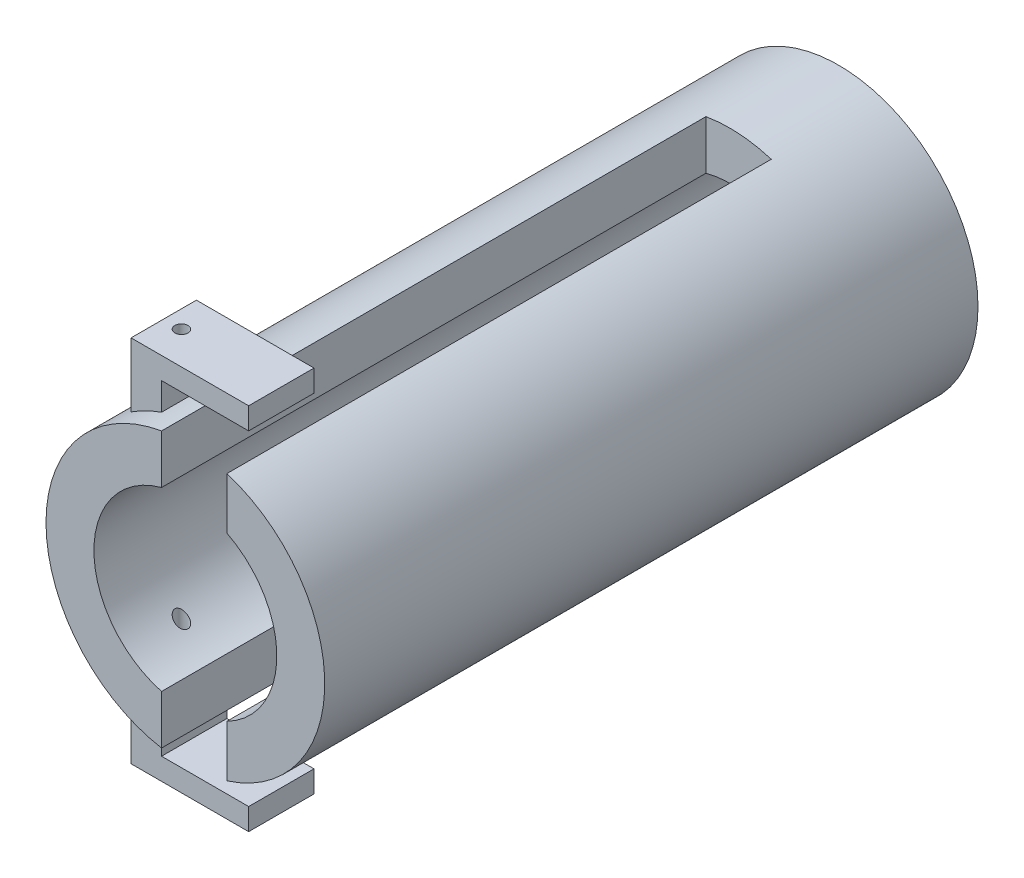
ISO-10303-21;
HEADER;
FILE_DESCRIPTION(('STEP AP214'),'2;1');
FILE_NAME('part.step','',(''),(''),'','','');
FILE_SCHEMA(('AUTOMOTIVE_DESIGN { 1 0 10303 214 1 1 1 1 }'));
ENDSEC;
DATA;
#1=APPLICATION_CONTEXT('core data for automotive mechanical design processes');
#2=APPLICATION_PROTOCOL_DEFINITION('international standard','automotive_design',2000,#1);
#3=PRODUCT_CONTEXT('',#1,'mechanical');
#4=PRODUCT('Part','Part','',(#3));
#5=PRODUCT_RELATED_PRODUCT_CATEGORY('part','',(#4));
#6=PRODUCT_DEFINITION_FORMATION('','',#4);
#7=PRODUCT_DEFINITION_CONTEXT('part definition',#1,'design');
#8=PRODUCT_DEFINITION('design','',#6,#7);
#9=PRODUCT_DEFINITION_SHAPE('','',#8);
#10=(LENGTH_UNIT() NAMED_UNIT(*) SI_UNIT(.MILLI.,.METRE.));
#11=(NAMED_UNIT(*) PLANE_ANGLE_UNIT() SI_UNIT($,.RADIAN.));
#12=(NAMED_UNIT(*) SI_UNIT($,.STERADIAN.) SOLID_ANGLE_UNIT());
#13=UNCERTAINTY_MEASURE_WITH_UNIT(LENGTH_MEASURE(1.E-05),#10,'distance_accuracy_value','');
#14=(GEOMETRIC_REPRESENTATION_CONTEXT(3) GLOBAL_UNCERTAINTY_ASSIGNED_CONTEXT((#13)) GLOBAL_UNIT_ASSIGNED_CONTEXT((#10,
#11,#12)) REPRESENTATION_CONTEXT('',''));
#15=CARTESIAN_POINT('',(0.,0.,0.));
#16=DIRECTION('',(0.,0.,1.));
#17=DIRECTION('',(1.,0.,0.));
#18=AXIS2_PLACEMENT_3D('',#15,#16,#17);
#19=CARTESIAN_POINT('',(-10.4655929490742,-43.1641768158116,130.));
#20=DIRECTION('',(1.,0.,0.));
#21=DIRECTION('',(0.,1.,0.));
#22=AXIS2_PLACEMENT_3D('',#19,#20,#21);
#23=PLANE('',#22);
#24=DIRECTION('',(0.,1.,0.));
#25=VECTOR('',#24,1.);
#26=CARTESIAN_POINT('',(-10.4655929490742,-43.1641768158116,130.));
#27=LINE('',#26,#25);
#28=CARTESIAN_POINT('',(-10.4655929490734,30.2402275822174,130.));
#29=VERTEX_POINT('',#28);
#30=CARTESIAN_POINT('',(-10.4655929490733,36.5327179011301,130.));
#31=VERTEX_POINT('',#30);
#32=EDGE_CURVE('E237',#29,#31,#27,.T.);
#33=ORIENTED_EDGE('',*,*,#32,.T.);
#34=DIRECTION('',(0.,0.,-1.));
#35=VECTOR('',#34,1.);
#36=CARTESIAN_POINT('',(-10.4655929490734,36.5327179011301,145.));
#37=LINE('',#36,#35);
#38=CARTESIAN_POINT('',(-10.4655929490734,36.5327179011301,145.));
#39=VERTEX_POINT('',#38);
#40=EDGE_CURVE('E203',#39,#31,#37,.T.);
#41=ORIENTED_EDGE('',*,*,#40,.F.);
#42=DIRECTION('',(0.,1.,0.));
#43=VECTOR('',#42,1.);
#44=CARTESIAN_POINT('',(-10.4655929490742,-43.1641768158116,145.));
#45=LINE('',#44,#43);
#46=CARTESIAN_POINT('',(-10.4655929490735,30.2402275822174,145.));
#47=VERTEX_POINT('',#46);
#48=EDGE_CURVE('E59',#47,#39,#45,.T.);
#49=ORIENTED_EDGE('',*,*,#48,.F.);
#50=DIRECTION('',(0.,0.,-1.));
#51=VECTOR('',#50,1.);
#52=CARTESIAN_POINT('',(-10.4655929490735,30.2402275822174,150.));
#53=LINE('',#52,#51);
#54=EDGE_CURVE('E225',#47,#29,#53,.T.);
#55=ORIENTED_EDGE('',*,*,#54,.T.);
#56=EDGE_LOOP('',(#33,#41,#49,#55));
#57=FACE_BOUND('',#56,.T.);
#58=ADVANCED_FACE('F43',(#57),#23,.T.);
#59=CARTESIAN_POINT('',(-10.4655929490734,32.002,145.));
#60=DIRECTION('',(1.,0.,0.));
#61=DIRECTION('',(0.,0.,-1.));
#62=AXIS2_PLACEMENT_3D('',#59,#60,#61);
#63=PLANE('',#62);
#64=DIRECTION('',(0.,-1.,0.));
#65=VECTOR('',#64,1.);
#66=CARTESIAN_POINT('',(-10.4655929490734,32.002,145.));
#67=LINE('',#66,#65);
#68=CARTESIAN_POINT('',(-10.4655929490732,-30.2402275822175,145.));
#69=VERTEX_POINT('',#68);
#70=CARTESIAN_POINT('',(-10.4655929490732,-38.1621768158119,145.));
#71=VERTEX_POINT('',#70);
#72=EDGE_CURVE('E292',#69,#71,#67,.T.);
#73=ORIENTED_EDGE('',*,*,#72,.T.);
#74=DIRECTION('',(0.,0.,1.));
#75=VECTOR('',#74,1.);
#76=CARTESIAN_POINT('',(-10.4655929490732,-38.1621768158119,145.));
#77=LINE('',#76,#75);
#78=CARTESIAN_POINT('',(-10.4655929490733,-38.1621768158119,130.));
#79=VERTEX_POINT('',#78);
#80=EDGE_CURVE('E241',#79,#71,#77,.T.);
#81=ORIENTED_EDGE('',*,*,#80,.F.);
#82=DIRECTION('',(0.,-1.,0.));
#83=VECTOR('',#82,1.);
#84=CARTESIAN_POINT('',(-10.4655929490735,32.002,130.));
#85=LINE('',#84,#83);
#86=CARTESIAN_POINT('',(-10.4655929490732,-30.2402275822175,130.));
#87=VERTEX_POINT('',#86);
#88=EDGE_CURVE('E67',#87,#79,#85,.T.);
#89=ORIENTED_EDGE('',*,*,#88,.F.);
#90=DIRECTION('',(0.,0.,-1.));
#91=VECTOR('',#90,1.);
#92=CARTESIAN_POINT('',(-10.4655929490732,-30.2402275822175,150.));
#93=LINE('',#92,#91);
#94=EDGE_CURVE('E288',#87,#69,#93,.F.);
#95=ORIENTED_EDGE('',*,*,#94,.T.);
#96=EDGE_LOOP('',(#73,#81,#89,#95));
#97=FACE_BOUND('',#96,.T.);
#98=ADVANCED_FACE('F445',(#97),#63,.T.);
#99=CARTESIAN_POINT('',(0.,0.,150.));
#100=DIRECTION('',(0.,0.,1.));
#101=DIRECTION('',(1.,0.,0.));
#102=AXIS2_PLACEMENT_3D('',#99,#100,#101);
#103=PLANE('',#102);
#104=DIRECTION('',(0.,-1.,0.));
#105=VECTOR('',#104,1.);
#106=CARTESIAN_POINT('',(9.53440705092656,32.0000000000001,150.));
#107=LINE('',#106,#105);
#108=CARTESIAN_POINT('',(9.53440705092673,-18.7108279396514,150.));
#109=VERTEX_POINT('',#108);
#110=CARTESIAN_POINT('',(9.53440705092677,-30.546605084481,150.));
#111=VERTEX_POINT('',#110);
#112=EDGE_CURVE('E296',#109,#111,#107,.T.);
#113=ORIENTED_EDGE('',*,*,#112,.T.);
#114=CARTESIAN_POINT('',(0.,0.,150.));
#115=DIRECTION('',(0.,0.,1.));
#116=DIRECTION('',(1.,0.,0.));
#117=AXIS2_PLACEMENT_3D('',#114,#115,#116);
#118=CIRCLE('',#117,32.);
#119=CARTESIAN_POINT('',(9.53440705092656,30.546605084481,150.));
#120=VERTEX_POINT('',#119);
#121=EDGE_CURVE('E356',#111,#120,#118,.T.);
#122=ORIENTED_EDGE('',*,*,#121,.T.);
#123=CARTESIAN_POINT('',(9.5344070509266,18.7108279396514,150.));
#124=VERTEX_POINT('',#123);
#125=EDGE_CURVE('E322',#120,#124,#107,.T.);
#126=ORIENTED_EDGE('',*,*,#125,.T.);
#127=CARTESIAN_POINT('',(0.,0.,150.));
#128=DIRECTION('',(0.,0.,1.));
#129=DIRECTION('',(1.,0.,0.));
#130=AXIS2_PLACEMENT_3D('',#127,#128,#129);
#131=CIRCLE('',#130,21.);
#132=EDGE_CURVE('E348',#109,#124,#131,.T.);
#133=ORIENTED_EDGE('',*,*,#132,.F.);
#134=EDGE_LOOP('',(#113,#122,#126,#133));
#135=FACE_BOUND('',#134,.T.);
#136=ADVANCED_FACE('F399',(#135),#103,.T.);
#137=DIRECTION('',(0.,-1.,0.));
#138=VECTOR('',#137,1.);
#139=CARTESIAN_POINT('',(-5.46559294907344,32.0000000000001,150.));
#140=LINE('',#139,#138);
#141=CARTESIAN_POINT('',(-5.46559294907344,31.5297842319772,150.));
#142=VERTEX_POINT('',#141);
#143=CARTESIAN_POINT('',(-5.4655929490734,20.2762741576217,150.));
#144=VERTEX_POINT('',#143);
#145=EDGE_CURVE('E318',#142,#144,#140,.T.);
#146=ORIENTED_EDGE('',*,*,#145,.F.);
#147=CARTESIAN_POINT('',(-5.46559294907323,-31.5297842319772,150.));
#148=VERTEX_POINT('',#147);
#149=EDGE_CURVE('E360',#142,#148,#118,.T.);
#150=ORIENTED_EDGE('',*,*,#149,.T.);
#151=CARTESIAN_POINT('',(-5.46559294907326,-20.2762741576218,150.));
#152=VERTEX_POINT('',#151);
#153=EDGE_CURVE('E319',#152,#148,#140,.T.);
#154=ORIENTED_EDGE('',*,*,#153,.F.);
#155=EDGE_CURVE('E352',#144,#152,#131,.T.);
#156=ORIENTED_EDGE('',*,*,#155,.F.);
#157=EDGE_LOOP('',(#146,#150,#154,#156));
#158=FACE_BOUND('',#157,.T.);
#159=ADVANCED_FACE('F413',(#158),#103,.T.);
#160=CARTESIAN_POINT('',(0.,0.,0.));
#161=DIRECTION('',(0.,0.,1.));
#162=DIRECTION('',(1.,0.,0.));
#163=AXIS2_PLACEMENT_3D('',#160,#161,#162);
#164=PLANE('',#163);
#165=CARTESIAN_POINT('',(0.,0.,0.));
#166=DIRECTION('',(0.,0.,1.));
#167=DIRECTION('',(1.,0.,0.));
#168=AXIS2_PLACEMENT_3D('',#165,#166,#167);
#169=CIRCLE('',#168,32.);
#170=CARTESIAN_POINT('',(32.,0.,0.));
#171=VERTEX_POINT('',#170);
#172=EDGE_CURVE('E361',#171,#171,#169,.T.);
#173=ORIENTED_EDGE('',*,*,#172,.F.);
#174=EDGE_LOOP('',(#173));
#175=FACE_BOUND('',#174,.T.);
#176=CARTESIAN_POINT('',(0.,0.,0.));
#177=DIRECTION('',(0.,0.,1.));
#178=DIRECTION('',(1.,0.,0.));
#179=AXIS2_PLACEMENT_3D('',#176,#177,#178);
#180=CIRCLE('',#179,21.);
#181=CARTESIAN_POINT('',(21.,0.,0.));
#182=VERTEX_POINT('',#181);
#183=EDGE_CURVE('E347',#182,#182,#180,.T.);
#184=ORIENTED_EDGE('',*,*,#183,.T.);
#185=EDGE_LOOP('',(#184));
#186=FACE_BOUND('',#185,.T.);
#187=ADVANCED_FACE('F488',(#175,#186),#164,.F.);
#188=CARTESIAN_POINT('',(0.,0.,150.));
#189=DIRECTION('',(0.,0.,-1.));
#190=DIRECTION('',(-1.,0.,0.));
#191=AXIS2_PLACEMENT_3D('',#188,#189,#190);
#192=CYLINDRICAL_SURFACE('',#191,32.);
#193=CARTESIAN_POINT('',(0.,0.,145.));
#194=DIRECTION('',(0.,0.,1.));
#195=DIRECTION('',(1.,0.,0.));
#196=AXIS2_PLACEMENT_3D('',#193,#194,#195);
#197=CIRCLE('',#196,32.);
#198=CARTESIAN_POINT('',(-17.4655929490735,26.8133001127663,145.));
#199=VERTEX_POINT('',#198);
#200=EDGE_CURVE('E229',#199,#47,#197,.F.);
#201=ORIENTED_EDGE('',*,*,#200,.F.);
#202=DIRECTION('',(0.,0.,-1.));
#203=VECTOR('',#202,1.);
#204=CARTESIAN_POINT('',(-17.4655929490735,26.8133001127663,150.));
#205=LINE('',#204,#203);
#206=CARTESIAN_POINT('',(-17.4655929490734,26.8133001127663,130.));
#207=VERTEX_POINT('',#206);
#208=EDGE_CURVE('E232',#207,#199,#205,.F.);
#209=ORIENTED_EDGE('',*,*,#208,.F.);
#210=CARTESIAN_POINT('',(0.,0.,130.));
#211=DIRECTION('',(0.,0.,-1.));
#212=DIRECTION('',(-1.,0.,0.));
#213=AXIS2_PLACEMENT_3D('',#210,#211,#212);
#214=CIRCLE('',#213,32.);
#215=EDGE_CURVE('E224',#29,#207,#214,.F.);
#216=ORIENTED_EDGE('',*,*,#215,.F.);
#217=ORIENTED_EDGE('',*,*,#54,.F.);
#218=EDGE_LOOP('',(#201,#209,#216,#217));
#219=FACE_BOUND('',#218,.T.);
#220=DIRECTION('',(0.,0.,-1.));
#221=VECTOR('',#220,1.);
#222=CARTESIAN_POINT('',(-17.4655929490732,-26.8133001127665,150.));
#223=LINE('',#222,#221);
#224=CARTESIAN_POINT('',(-17.4655929490732,-26.8133001127665,145.));
#225=VERTEX_POINT('',#224);
#226=CARTESIAN_POINT('',(-17.4655929490733,-26.8133001127664,130.));
#227=VERTEX_POINT('',#226);
#228=EDGE_CURVE('E284',#225,#227,#223,.T.);
#229=ORIENTED_EDGE('',*,*,#228,.F.);
#230=CARTESIAN_POINT('',(0.,0.,145.));
#231=DIRECTION('',(0.,0.,1.));
#232=DIRECTION('',(1.,0.,0.));
#233=AXIS2_PLACEMENT_3D('',#230,#231,#232);
#234=CIRCLE('',#233,32.);
#235=EDGE_CURVE('E283',#69,#225,#234,.F.);
#236=ORIENTED_EDGE('',*,*,#235,.F.);
#237=ORIENTED_EDGE('',*,*,#94,.F.);
#238=CARTESIAN_POINT('',(0.,0.,130.));
#239=DIRECTION('',(0.,0.,-1.));
#240=DIRECTION('',(-1.,0.,0.));
#241=AXIS2_PLACEMENT_3D('',#238,#239,#240);
#242=CIRCLE('',#241,32.);
#243=EDGE_CURVE('E287',#227,#87,#242,.F.);
#244=ORIENTED_EDGE('',*,*,#243,.F.);
#245=EDGE_LOOP('',(#229,#236,#237,#244));
#246=FACE_BOUND('',#245,.T.);
#247=DIRECTION('',(0.,0.,-1.));
#248=VECTOR('',#247,1.);
#249=CARTESIAN_POINT('',(-5.46559294907344,31.5297842319772,150.));
#250=LINE('',#249,#248);
#251=CARTESIAN_POINT('',(-5.46559294907386,31.5297842319772,24.9999999999999));
#252=VERTEX_POINT('',#251);
#253=EDGE_CURVE('E330',#142,#252,#250,.T.);
#254=ORIENTED_EDGE('',*,*,#253,.T.);
#255=CARTESIAN_POINT('',(0.,0.,24.9999999999999));
#256=DIRECTION('',(0.,0.,-1.));
#257=DIRECTION('',(-1.,0.,0.));
#258=AXIS2_PLACEMENT_3D('',#255,#256,#257);
#259=CIRCLE('',#258,32.);
#260=CARTESIAN_POINT('',(9.53440705092612,30.5466050844812,24.9999999999998));
#261=VERTEX_POINT('',#260);
#262=EDGE_CURVE('E338',#252,#261,#259,.T.);
#263=ORIENTED_EDGE('',*,*,#262,.T.);
#264=DIRECTION('',(0.,0.,-1.));
#265=VECTOR('',#264,1.);
#266=CARTESIAN_POINT('',(9.53440705092656,30.546605084481,150.));
#267=LINE('',#266,#265);
#268=EDGE_CURVE('E339',#261,#120,#267,.F.);
#269=ORIENTED_EDGE('',*,*,#268,.T.);
#270=ORIENTED_EDGE('',*,*,#121,.F.);
#271=DIRECTION('',(0.,0.,-1.));
#272=VECTOR('',#271,1.);
#273=CARTESIAN_POINT('',(9.53440705092677,-30.546605084481,150.));
#274=LINE('',#273,#272);
#275=CARTESIAN_POINT('',(9.53440705092633,-30.5466050844811,24.9999999999998));
#276=VERTEX_POINT('',#275);
#277=EDGE_CURVE('E343',#111,#276,#274,.T.);
#278=ORIENTED_EDGE('',*,*,#277,.T.);
#279=CARTESIAN_POINT('',(-5.46559294907365,-31.5297842319772,24.9999999999999));
#280=VERTEX_POINT('',#279);
#281=EDGE_CURVE('E334',#276,#280,#259,.T.);
#282=ORIENTED_EDGE('',*,*,#281,.T.);
#283=DIRECTION('',(0.,0.,-1.));
#284=VECTOR('',#283,1.);
#285=CARTESIAN_POINT('',(-5.46559294907323,-31.5297842319772,150.));
#286=LINE('',#285,#284);
#287=EDGE_CURVE('E326',#280,#148,#286,.F.);
#288=ORIENTED_EDGE('',*,*,#287,.T.);
#289=ORIENTED_EDGE('',*,*,#149,.F.);
#290=EDGE_LOOP('',(#254,#263,#269,#270,#278,#282,#288,#289));
#291=FACE_BOUND('',#290,.T.);
#292=ORIENTED_EDGE('',*,*,#172,.T.);
#293=EDGE_LOOP('',(#292));
#294=FACE_BOUND('',#293,.T.);
#295=ADVANCED_FACE('F45',(#219,#246,#291,#294),#192,.T.);
#296=CARTESIAN_POINT('',(0.,0.,150.));
#297=DIRECTION('',(0.,0.,-1.));
#298=DIRECTION('',(-1.,0.,0.));
#299=AXIS2_PLACEMENT_3D('',#296,#297,#298);
#300=CYLINDRICAL_SURFACE('',#299,21.);
#301=CARTESIAN_POINT('',(-11.9052452002642,17.2992813932136,137.5));
#302=CARTESIAN_POINT('',(-11.9052548265942,17.2992755508608,137.573044116723));
#303=CARTESIAN_POINT('',(-11.9106205752926,17.295585983972,137.646197513668));
#304=CARTESIAN_POINT('',(-11.9318019819764,17.2809795849291,137.790349620127));
#305=CARTESIAN_POINT('',(-11.9476443826521,17.2700442571132,137.861342327892));
#306=CARTESIAN_POINT('',(-11.9887861127634,17.241508811331,137.99876218566));
#307=CARTESIAN_POINT('',(-12.014045424554,17.2239368918283,138.065207266594));
#308=CARTESIAN_POINT('',(-12.07273230127,17.1828522462299,138.192325739823));
#309=CARTESIAN_POINT('',(-12.1061573190968,17.1593413725725,138.253000923718));
#310=CARTESIAN_POINT('',(-12.1818833095306,17.1056712265187,138.370964200516));
#311=CARTESIAN_POINT('',(-12.2245860160203,17.0752059315197,138.427853042159));
#312=CARTESIAN_POINT('',(-12.3158826277543,17.0094738931302,138.533524338874));
#313=CARTESIAN_POINT('',(-12.3644794002015,16.9742048118754,138.582302821039));
#314=CARTESIAN_POINT('',(-12.4744038412467,16.8936262634548,138.678866728555));
#315=CARTESIAN_POINT('',(-12.5365123417045,16.8476187589333,138.725177471959));
#316=CARTESIAN_POINT('',(-12.6646903137788,16.7514792161448,138.8066584163));
#317=CARTESIAN_POINT('',(-12.7307623534542,16.7013444957649,138.841821299537));
#318=CARTESIAN_POINT('',(-12.8786505324283,16.587666416646,138.907292403603));
#319=CARTESIAN_POINT('',(-12.9609842642626,16.5234394817461,138.935243911826));
#320=CARTESIAN_POINT('',(-13.1268694347995,16.391965565268,138.976421626484));
#321=CARTESIAN_POINT('',(-13.2104214627617,16.3247170871463,138.989640450419));
#322=CARTESIAN_POINT('',(-13.3931402778305,16.1752970561648,139.003257623873));
#323=CARTESIAN_POINT('',(-13.492219901029,16.0927427211358,139.000701570316));
#324=CARTESIAN_POINT('',(-13.6875943737514,15.9269027502493,138.97647828892));
#325=CARTESIAN_POINT('',(-13.7838845842737,15.8436161662836,138.954780922891));
#326=CARTESIAN_POINT('',(-13.9821053811629,15.669079613006,138.889010290197));
#327=CARTESIAN_POINT('',(-14.0834440613879,15.5779930916758,138.842685883429));
#328=CARTESIAN_POINT('',(-14.2766026823651,15.4011571407549,138.726141715687));
#329=CARTESIAN_POINT('',(-14.368442309674,15.3153968264529,138.655972721103));
#330=CARTESIAN_POINT('',(-14.5054296733106,15.1854461811735,138.522217981724));
#331=CARTESIAN_POINT('',(-14.5549996155984,15.1379033470334,138.466381766895));
#332=CARTESIAN_POINT('',(-14.6470179251289,15.0488846844269,138.344860345745));
#333=CARTESIAN_POINT('',(-14.6894785218866,15.0073984534578,138.279192428451));
#334=CARTESIAN_POINT('',(-14.7572487648846,14.9407294148004,138.152773966086));
#335=CARTESIAN_POINT('',(-14.7842895484931,14.9139488384994,138.093803404615));
#336=CARTESIAN_POINT('',(-14.8311000527988,14.8673993304998,137.970405449812));
#337=CARTESIAN_POINT('',(-14.8508741971697,14.8476261332181,137.905981405858));
#338=CARTESIAN_POINT('',(-14.8818945608282,14.8165351093517,137.772464925328));
#339=CARTESIAN_POINT('',(-14.893065311665,14.8052921217324,137.703336838484));
#340=CARTESIAN_POINT('',(-14.9055508564446,14.7927225828124,137.563317276506));
#341=CARTESIAN_POINT('',(-14.9068736953809,14.7913879371539,137.492427288228));
#342=CARTESIAN_POINT('',(-14.9000709408295,14.7982395648824,137.361449128951));
#343=CARTESIAN_POINT('',(-14.8932215895962,14.8051398363758,137.30121797823));
#344=CARTESIAN_POINT('',(-14.8726295320708,14.8258255041481,137.183182362743));
#345=CARTESIAN_POINT('',(-14.8588854849967,14.8396122396061,137.125378372348));
#346=CARTESIAN_POINT('',(-14.8249050977801,14.8735595306512,137.011981202268));
#347=CARTESIAN_POINT('',(-14.8045117826467,14.8938740049396,136.95648230499));
#348=CARTESIAN_POINT('',(-14.7583605076822,14.9396068839805,136.850037934527));
#349=CARTESIAN_POINT('',(-14.732599797427,14.9650279052497,136.799094815072));
#350=CARTESIAN_POINT('',(-14.6612361215834,15.0350196334455,136.675364553637));
#351=CARTESIAN_POINT('',(-14.6125127689926,15.082432561015,136.605974453225));
#352=CARTESIAN_POINT('',(-14.5071609770133,15.1837961619827,136.478908732529));
#353=CARTESIAN_POINT('',(-14.4505122623975,15.2377635552457,136.421264120046));
#354=CARTESIAN_POINT('',(-14.3114302866695,15.3686308028926,136.300023909923));
#355=CARTESIAN_POINT('',(-14.2266958554917,15.4471791121736,136.240847918807));
#356=CARTESIAN_POINT('',(-14.0500060121881,15.608064109138,136.14185883437));
#357=CARTESIAN_POINT('',(-13.9580474467042,15.6904024446137,136.102054251891));
#358=CARTESIAN_POINT('',(-13.7676786363668,15.8577213794313,136.040963787914));
#359=CARTESIAN_POINT('',(-13.6691885264799,15.9427231765462,136.019985409855));
#360=CARTESIAN_POINT('',(-13.4692629747421,16.111987087823,135.99799488572));
#361=CARTESIAN_POINT('',(-13.3678256238155,16.196248674328,135.996995983735));
#362=CARTESIAN_POINT('',(-13.15521795371,16.3695047565603,136.016792053278));
#363=CARTESIAN_POINT('',(-13.0440021414693,16.4582319286303,136.039579053535));
#364=CARTESIAN_POINT('',(-12.8253138727645,16.6292051039563,136.11187904325));
#365=CARTESIAN_POINT('',(-12.7178343204254,16.7114638150159,136.161338050089));
#366=CARTESIAN_POINT('',(-12.5470098163756,16.8398313462938,136.267164081613));
#367=CARTESIAN_POINT('',(-12.4809333364183,16.8888245617175,136.315678358624));
#368=CARTESIAN_POINT('',(-12.3554618318187,16.9808296313963,136.425351061054));
#369=CARTESIAN_POINT('',(-12.2960565481847,17.0238506943972,136.486489650007));
#370=CARTESIAN_POINT('',(-12.1952088764273,17.0962023306363,136.610519397818));
#371=CARTESIAN_POINT('',(-12.1524094814051,17.1266213717917,136.671668694717));
#372=CARTESIAN_POINT('',(-12.0754433857335,17.1809746596213,136.801903002128));
#373=CARTESIAN_POINT('',(-12.0412795545109,17.204906751001,136.870990639331));
#374=CARTESIAN_POINT('',(-11.9832989817467,17.2453418165766,137.016042415099));
#375=CARTESIAN_POINT('',(-11.9595562340493,17.2617916930384,137.092051243928));
#376=CARTESIAN_POINT('',(-11.9244129333531,17.2860883676311,137.248044440917));
#377=CARTESIAN_POINT('',(-11.9129729434584,17.2939626561281,137.328015241286));
#378=CARTESIAN_POINT('',(-11.9061745459405,17.298641575654,137.438903471857));
#379=CARTESIAN_POINT('',(-11.9052411731127,17.2992838373476,137.469442173108));
#380=CARTESIAN_POINT('',(-11.9052452002642,17.2992813932136,137.5));
#381=B_SPLINE_CURVE_WITH_KNOTS('',3,(#301,#302,#303,#304,#305,#306,#307,#308,#309,#310,#311,
#312,#313,#314,#315,#316,#317,#318,#319,#320,#321,#322,#323,#324,#325,#326,#327,#328,#329,#330,
#331,#332,#333,#334,#335,#336,#337,#338,#339,#340,#341,#342,#343,#344,#345,#346,#347,#348,#349,
#350,#351,#352,#353,#354,#355,#356,#357,#358,#359,#360,#361,#362,#363,#364,#365,#366,#367,#368,
#369,#370,#371,#372,#373,#374,#375,#376,#377,#378,#379,#380),.UNSPECIFIED.,.T.,.F.,(4,2,2,2,2,2,
2,2,2,2,2,2,2,2,2,2,2,2,2,2,2,2,2,2,2,2,2,2,2,2,2,2,2,2,2,2,2,2,2,4),(0.,0.21903959242567,
0.438640474464683,0.657318595790343,0.875928592557461,1.10719045162189,1.33856526401803,
1.6078838377831,1.87737883387967,2.20047687162462,2.5237367400696,2.90916314853013,
3.29519750006137,3.72484748081865,4.15358838633279,4.41832259995696,4.68259663120421,
4.89235532376933,5.10198611026862,5.31343545766322,5.52471204808042,5.70688943648973,
5.88910226590239,6.07597280624511,6.26293934155278,6.55274272200877,6.84330153699267,
7.23069818161217,7.61826487587563,8.01205249573606,8.40610114276814,8.83601743925096,
9.26506685757901,9.5505130724608,9.83551413561295,10.0763213313497,10.3172084376761,
10.5597793101415,10.80157027446,10.8932049501633),.UNSPECIFIED.);
#382=CARTESIAN_POINT('',(-11.9052452002642,17.2992813932136,137.5));
#383=VERTEX_POINT('',#382);
#384=EDGE_CURVE('E514',#383,#383,#381,.T.);
#385=ORIENTED_EDGE('',*,*,#384,.F.);
#386=EDGE_LOOP('',(#385));
#387=FACE_BOUND('',#386,.T.);
#388=CARTESIAN_POINT('',(-11.9052452002641,-17.2992813932137,137.5));
#389=CARTESIAN_POINT('',(-11.9052548265941,-17.2992755508609,137.426955883277));
#390=CARTESIAN_POINT('',(-11.9106205752924,-17.2955859839721,137.353802486332));
#391=CARTESIAN_POINT('',(-11.9318019819763,-17.2809795849292,137.209650379873));
#392=CARTESIAN_POINT('',(-11.9476443826519,-17.2700442571133,137.138657672108));
#393=CARTESIAN_POINT('',(-11.9887861127633,-17.2415088113311,137.00123781434));
#394=CARTESIAN_POINT('',(-12.0140454245539,-17.2239368918284,136.934792733407));
#395=CARTESIAN_POINT('',(-12.0727323012699,-17.18285224623,136.807674260178));
#396=CARTESIAN_POINT('',(-12.1061573190967,-17.1593413725726,136.746999076282));
#397=CARTESIAN_POINT('',(-12.1818833095305,-17.1056712265188,136.629035799484));
#398=CARTESIAN_POINT('',(-12.2245860160201,-17.0752059315198,136.572146957841));
#399=CARTESIAN_POINT('',(-12.3158826277542,-17.0094738931303,136.466475661126));
#400=CARTESIAN_POINT('',(-12.3644794002014,-16.9742048118755,136.417697178962));
#401=CARTESIAN_POINT('',(-12.4744038412465,-16.8936262634549,136.321133271445));
#402=CARTESIAN_POINT('',(-12.5365123417044,-16.8476187589333,136.274822528042));
#403=CARTESIAN_POINT('',(-12.6646903137787,-16.7514792161449,136.193341583701));
#404=CARTESIAN_POINT('',(-12.7307623534541,-16.701344495765,136.158178700463));
#405=CARTESIAN_POINT('',(-12.8786505324282,-16.5876664166461,136.092707596397));
#406=CARTESIAN_POINT('',(-12.9609842642625,-16.5234394817462,136.064756088174));
#407=CARTESIAN_POINT('',(-13.1268694347993,-16.3919655652681,136.023578373516));
#408=CARTESIAN_POINT('',(-13.2104214627616,-16.3247170871464,136.010359549582));
#409=CARTESIAN_POINT('',(-13.3931402778303,-16.1752970561649,135.996742376127));
#410=CARTESIAN_POINT('',(-13.4922199010289,-16.0927427211359,135.999298429684));
#411=CARTESIAN_POINT('',(-13.6875943737513,-15.9269027502494,136.02352171108));
#412=CARTESIAN_POINT('',(-13.7838845842736,-15.8436161662838,136.04521907711));
#413=CARTESIAN_POINT('',(-13.9821053811628,-15.6690796130061,136.110989709803));
#414=CARTESIAN_POINT('',(-14.0834440613878,-15.5779930916759,136.157314116571));
#415=CARTESIAN_POINT('',(-14.2766026823649,-15.401157140755,136.273858284313));
#416=CARTESIAN_POINT('',(-14.3684423096739,-15.315396826453,136.344027278897));
#417=CARTESIAN_POINT('',(-14.5054296733105,-15.1854461811736,136.477782018276));
#418=CARTESIAN_POINT('',(-14.5549996155983,-15.1379033470335,136.533618233105));
#419=CARTESIAN_POINT('',(-14.6470179251288,-15.048884684427,136.655139654255));
#420=CARTESIAN_POINT('',(-14.6894785218864,-15.007398453458,136.720807571549));
#421=CARTESIAN_POINT('',(-14.7572487648845,-14.9407294148006,136.847226033914));
#422=CARTESIAN_POINT('',(-14.784289548493,-14.9139488384995,136.906196595385));
#423=CARTESIAN_POINT('',(-14.8311000527987,-14.8673993304999,137.029594550188));
#424=CARTESIAN_POINT('',(-14.8508741971696,-14.8476261332182,137.094018594142));
#425=CARTESIAN_POINT('',(-14.8818945608281,-14.8165351093519,137.227535074672));
#426=CARTESIAN_POINT('',(-14.8930653116649,-14.8052921217325,137.296663161516));
#427=CARTESIAN_POINT('',(-14.9055508564445,-14.7927225828125,137.436682723494));
#428=CARTESIAN_POINT('',(-14.9068736953808,-14.791387937154,137.507572711772));
#429=CARTESIAN_POINT('',(-14.9000709408294,-14.7982395648825,137.638550871049));
#430=CARTESIAN_POINT('',(-14.893221589596,-14.8051398363759,137.69878202177));
#431=CARTESIAN_POINT('',(-14.8726295320707,-14.8258255041482,137.816817637257));
#432=CARTESIAN_POINT('',(-14.8588854849966,-14.8396122396063,137.874621627653));
#433=CARTESIAN_POINT('',(-14.82490509778,-14.8735595306513,137.988018797732));
#434=CARTESIAN_POINT('',(-14.8045117826466,-14.8938740049397,138.04351769501));
#435=CARTESIAN_POINT('',(-14.7583605076821,-14.9396068839806,138.149962065473));
#436=CARTESIAN_POINT('',(-14.7325997974269,-14.9650279052498,138.200905184928));
#437=CARTESIAN_POINT('',(-14.6612361215833,-15.0350196334456,138.324635446363));
#438=CARTESIAN_POINT('',(-14.6125127689925,-15.0824325610151,138.394025546775));
#439=CARTESIAN_POINT('',(-14.5071609770132,-15.1837961619828,138.521091267472));
#440=CARTESIAN_POINT('',(-14.4505122623974,-15.2377635552458,138.578735879954));
#441=CARTESIAN_POINT('',(-14.3114302866693,-15.3686308028927,138.699976090077));
#442=CARTESIAN_POINT('',(-14.2266958554915,-15.4471791121737,138.759152081193));
#443=CARTESIAN_POINT('',(-14.0500060121879,-15.6080641091381,138.85814116563));
#444=CARTESIAN_POINT('',(-13.958047446704,-15.6904024446138,138.897945748109));
#445=CARTESIAN_POINT('',(-13.7676786363666,-15.8577213794315,138.959036212086));
#446=CARTESIAN_POINT('',(-13.6691885264797,-15.9427231765463,138.980014590146));
#447=CARTESIAN_POINT('',(-13.469262974742,-16.1119870878232,139.00200511428));
#448=CARTESIAN_POINT('',(-13.3678256238153,-16.1962486743282,139.003004016265));
#449=CARTESIAN_POINT('',(-13.1552179537098,-16.3695047565604,138.983207946722));
#450=CARTESIAN_POINT('',(-13.0440021414692,-16.4582319286304,138.960420946465));
#451=CARTESIAN_POINT('',(-12.8253138727643,-16.6292051039564,138.88812095675));
#452=CARTESIAN_POINT('',(-12.7178343204252,-16.711463815016,138.838661949911));
#453=CARTESIAN_POINT('',(-12.5470098163755,-16.8398313462939,138.732835918387));
#454=CARTESIAN_POINT('',(-12.4809333364181,-16.8888245617176,138.684321641376));
#455=CARTESIAN_POINT('',(-12.3554618318185,-16.9808296313964,138.574648938947));
#456=CARTESIAN_POINT('',(-12.2960565481846,-17.0238506943973,138.513510349993));
#457=CARTESIAN_POINT('',(-12.1952088764271,-17.0962023306364,138.389480602182));
#458=CARTESIAN_POINT('',(-12.1524094814049,-17.1266213717918,138.328331305283));
#459=CARTESIAN_POINT('',(-12.0754433857333,-17.1809746596214,138.198096997872));
#460=CARTESIAN_POINT('',(-12.0412795545107,-17.2049067510011,138.129009360669));
#461=CARTESIAN_POINT('',(-11.9832989817465,-17.2453418165767,137.983957584901));
#462=CARTESIAN_POINT('',(-11.9595562340491,-17.2617916930385,137.907948756072));
#463=CARTESIAN_POINT('',(-11.9244129333529,-17.2860883676312,137.751955559083));
#464=CARTESIAN_POINT('',(-11.9129729434582,-17.2939626561282,137.671984758714));
#465=CARTESIAN_POINT('',(-11.9061745459403,-17.2986415756541,137.561096528143));
#466=CARTESIAN_POINT('',(-11.9052411731125,-17.2992838373477,137.530557826892));
#467=CARTESIAN_POINT('',(-11.9052452002641,-17.2992813932137,137.5));
#468=B_SPLINE_CURVE_WITH_KNOTS('',3,(#388,#389,#390,#391,#392,#393,#394,#395,#396,#397,#398,
#399,#400,#401,#402,#403,#404,#405,#406,#407,#408,#409,#410,#411,#412,#413,#414,#415,#416,#417,
#418,#419,#420,#421,#422,#423,#424,#425,#426,#427,#428,#429,#430,#431,#432,#433,#434,#435,#436,
#437,#438,#439,#440,#441,#442,#443,#444,#445,#446,#447,#448,#449,#450,#451,#452,#453,#454,#455,
#456,#457,#458,#459,#460,#461,#462,#463,#464,#465,#466,#467),.UNSPECIFIED.,.T.,.F.,(4,2,2,2,2,2,
2,2,2,2,2,2,2,2,2,2,2,2,2,2,2,2,2,2,2,2,2,2,2,2,2,2,2,2,2,2,2,2,2,4),(0.,0.219039592425671,
0.438640474464684,0.657318595790343,0.875928592557437,1.10719045162188,1.33856526401803,
1.6078838377831,1.87737883387967,2.20047687162461,2.52373674006958,2.90916314853012,
3.29519750006136,3.72484748081865,4.15358838633278,4.41832259995695,4.68259663120422,
4.89235532376938,5.10198611026861,5.31343545766327,5.52471204808041,5.70688943648969,
5.88910226590235,6.0759728062451,6.26293934155277,6.55274272200878,6.84330153699269,
7.23069818161219,7.61826487587566,8.01205249573608,8.40610114276816,8.83601743925097,
9.26506685757902,9.55051307246081,9.83551413561297,10.0763213313498,10.3172084376761,
10.5597793101415,10.8015702744599,10.8932049501633),.UNSPECIFIED.);
#469=CARTESIAN_POINT('',(-11.9052452002641,-17.2992813932137,137.5));
#470=VERTEX_POINT('',#469);
#471=EDGE_CURVE('E517',#470,#470,#468,.T.);
#472=ORIENTED_EDGE('',*,*,#471,.F.);
#473=EDGE_LOOP('',(#472));
#474=FACE_BOUND('',#473,.T.);
#475=DIRECTION('',(0.,0.,-1.));
#476=VECTOR('',#475,1.);
#477=CARTESIAN_POINT('',(9.5344070509266,18.7108279396514,150.));
#478=LINE('',#477,#476);
#479=CARTESIAN_POINT('',(9.53440705092616,18.7108279396517,24.9999999999998));
#480=VERTEX_POINT('',#479);
#481=EDGE_CURVE('E11',#480,#124,#478,.F.);
#482=ORIENTED_EDGE('',*,*,#481,.F.);
#483=CARTESIAN_POINT('',(0.,0.,24.9999999999999));
#484=DIRECTION('',(0.,0.,-1.));
#485=DIRECTION('',(-1.,0.,0.));
#486=AXIS2_PLACEMENT_3D('',#483,#484,#485);
#487=CIRCLE('',#486,21.);
#488=CARTESIAN_POINT('',(-5.46559294907382,20.2762741576217,24.9999999999999));
#489=VERTEX_POINT('',#488);
#490=EDGE_CURVE('E52',#489,#480,#487,.T.);
#491=ORIENTED_EDGE('',*,*,#490,.F.);
#492=DIRECTION('',(0.,0.,-1.));
#493=VECTOR('',#492,1.);
#494=CARTESIAN_POINT('',(-5.4655929490734,20.2762741576217,150.));
#495=LINE('',#494,#493);
#496=EDGE_CURVE('E374',#144,#489,#495,.T.);
#497=ORIENTED_EDGE('',*,*,#496,.F.);
#498=ORIENTED_EDGE('',*,*,#155,.T.);
#499=DIRECTION('',(0.,0.,-1.));
#500=VECTOR('',#499,1.);
#501=CARTESIAN_POINT('',(-5.46559294907326,-20.2762741576218,150.));
#502=LINE('',#501,#500);
#503=CARTESIAN_POINT('',(-5.46559294907326,-20.2762741576218,24.9999999999999));
#504=VERTEX_POINT('',#503);
#505=EDGE_CURVE('E365',#504,#152,#502,.F.);
#506=ORIENTED_EDGE('',*,*,#505,.F.);
#507=CARTESIAN_POINT('',(9.53440705092629,-18.7108279396516,24.9999999999998));
#508=VERTEX_POINT('',#507);
#509=EDGE_CURVE('E368',#508,#504,#487,.T.);
#510=ORIENTED_EDGE('',*,*,#509,.F.);
#511=DIRECTION('',(0.,0.,-1.));
#512=VECTOR('',#511,1.);
#513=CARTESIAN_POINT('',(9.53440705092673,-18.7108279396514,150.));
#514=LINE('',#513,#512);
#515=EDGE_CURVE('E372',#109,#508,#514,.T.);
#516=ORIENTED_EDGE('',*,*,#515,.F.);
#517=ORIENTED_EDGE('',*,*,#132,.T.);
#518=EDGE_LOOP('',(#482,#491,#497,#498,#506,#510,#516,#517));
#519=FACE_BOUND('',#518,.T.);
#520=ORIENTED_EDGE('',*,*,#183,.F.);
#521=EDGE_LOOP('',(#520));
#522=FACE_BOUND('',#521,.T.);
#523=ADVANCED_FACE('F393',(#387,#474,#519,#522),#300,.F.);
#524=CARTESIAN_POINT('',(-5.46559294907386,32.0000000000001,24.9999999999999));
#525=DIRECTION('',(-1.,0.,0.));
#526=DIRECTION('',(0.,-1.,0.));
#527=AXIS2_PLACEMENT_3D('',#524,#525,#526);
#528=PLANE('',#527);
#529=DIRECTION('',(0.,-1.,0.));
#530=VECTOR('',#529,1.);
#531=CARTESIAN_POINT('',(-5.46559294907386,32.0000000000001,24.9999999999999));
#532=LINE('',#531,#530);
#533=EDGE_CURVE('E314',#504,#280,#532,.T.);
#534=ORIENTED_EDGE('',*,*,#533,.F.);
#535=ORIENTED_EDGE('',*,*,#505,.T.);
#536=ORIENTED_EDGE('',*,*,#153,.T.);
#537=ORIENTED_EDGE('',*,*,#287,.F.);
#538=EDGE_LOOP('',(#534,#535,#536,#537));
#539=FACE_BOUND('',#538,.T.);
#540=ADVANCED_FACE('F418',(#539),#528,.F.);
#541=CARTESIAN_POINT('',(9.53440705092612,32.0000000000001,24.9999999999998));
#542=DIRECTION('',(0.,0.,-1.));
#543=DIRECTION('',(-1.,0.,0.));
#544=AXIS2_PLACEMENT_3D('',#541,#542,#543);
#545=PLANE('',#544);
#546=DIRECTION('',(0.,-1.,0.));
#547=VECTOR('',#546,1.);
#548=CARTESIAN_POINT('',(9.53440705092612,32.0000000000001,24.9999999999998));
#549=LINE('',#548,#547);
#550=EDGE_CURVE('E308',#508,#276,#549,.T.);
#551=ORIENTED_EDGE('',*,*,#550,.F.);
#552=ORIENTED_EDGE('',*,*,#509,.T.);
#553=ORIENTED_EDGE('',*,*,#533,.T.);
#554=ORIENTED_EDGE('',*,*,#281,.F.);
#555=EDGE_LOOP('',(#551,#552,#553,#554));
#556=FACE_BOUND('',#555,.T.);
#557=ADVANCED_FACE('F421',(#556),#545,.F.);
#558=CARTESIAN_POINT('',(9.53440705092656,32.0000000000001,150.));
#559=DIRECTION('',(1.,0.,0.));
#560=DIRECTION('',(0.,0.,-1.));
#561=AXIS2_PLACEMENT_3D('',#558,#559,#560);
#562=PLANE('',#561);
#563=ORIENTED_EDGE('',*,*,#112,.F.);
#564=ORIENTED_EDGE('',*,*,#515,.T.);
#565=ORIENTED_EDGE('',*,*,#550,.T.);
#566=ORIENTED_EDGE('',*,*,#277,.F.);
#567=EDGE_LOOP('',(#563,#564,#565,#566));
#568=FACE_BOUND('',#567,.T.);
#569=ADVANCED_FACE('F424',(#568),#562,.F.);
#570=EDGE_CURVE('E312',#261,#480,#549,.T.);
#571=ORIENTED_EDGE('',*,*,#570,.T.);
#572=ORIENTED_EDGE('',*,*,#481,.T.);
#573=ORIENTED_EDGE('',*,*,#125,.F.);
#574=ORIENTED_EDGE('',*,*,#268,.F.);
#575=EDGE_LOOP('',(#571,#572,#573,#574));
#576=FACE_BOUND('',#575,.T.);
#577=ADVANCED_FACE('F390',(#576),#562,.F.);
#578=EDGE_CURVE('E313',#252,#489,#532,.T.);
#579=ORIENTED_EDGE('',*,*,#578,.T.);
#580=ORIENTED_EDGE('',*,*,#490,.T.);
#581=ORIENTED_EDGE('',*,*,#570,.F.);
#582=ORIENTED_EDGE('',*,*,#262,.F.);
#583=EDGE_LOOP('',(#579,#580,#581,#582));
#584=FACE_BOUND('',#583,.T.);
#585=ADVANCED_FACE('F385',(#584),#545,.F.);
#586=ORIENTED_EDGE('',*,*,#145,.T.);
#587=ORIENTED_EDGE('',*,*,#496,.T.);
#588=ORIENTED_EDGE('',*,*,#578,.F.);
#589=ORIENTED_EDGE('',*,*,#253,.F.);
#590=EDGE_LOOP('',(#586,#587,#588,#589));
#591=FACE_BOUND('',#590,.T.);
#592=ADVANCED_FACE('F425',(#591),#528,.F.);
#593=CARTESIAN_POINT('',(-10.4655929490734,32.002,145.));
#594=DIRECTION('',(0.,0.,1.));
#595=DIRECTION('',(1.,0.,0.));
#596=AXIS2_PLACEMENT_3D('',#593,#594,#595);
#597=PLANE('',#596);
#598=ORIENTED_EDGE('',*,*,#72,.F.);
#599=ORIENTED_EDGE('',*,*,#235,.T.);
#600=DIRECTION('',(0.,-1.,0.));
#601=VECTOR('',#600,1.);
#602=CARTESIAN_POINT('',(-17.4655929490734,32.0019999999999,145.));
#603=LINE('',#602,#601);
#604=CARTESIAN_POINT('',(-17.4655929490732,-43.1621768158119,145.));
#605=VERTEX_POINT('',#604);
#606=EDGE_CURVE('E291',#225,#605,#603,.T.);
#607=ORIENTED_EDGE('',*,*,#606,.T.);
#608=DIRECTION('',(-1.,0.,0.));
#609=VECTOR('',#608,1.);
#610=CARTESIAN_POINT('',(-10.4655929490732,-43.1621768158119,145.));
#611=LINE('',#610,#609);
#612=CARTESIAN_POINT('',(9.53440705092681,-43.1621768158118,145.));
#613=VERTEX_POINT('',#612);
#614=EDGE_CURVE('E272',#613,#605,#611,.T.);
#615=ORIENTED_EDGE('',*,*,#614,.F.);
#616=DIRECTION('',(0.,-1.,0.));
#617=VECTOR('',#616,1.);
#618=CARTESIAN_POINT('',(9.53440705092681,-43.1621768158118,145.));
#619=LINE('',#618,#617);
#620=CARTESIAN_POINT('',(9.53440705092679,-38.1621768158118,145.));
#621=VERTEX_POINT('',#620);
#622=EDGE_CURVE('E249',#621,#613,#619,.T.);
#623=ORIENTED_EDGE('',*,*,#622,.F.);
#624=DIRECTION('',(-1.,0.,0.));
#625=VECTOR('',#624,1.);
#626=CARTESIAN_POINT('',(9.53440705092679,-38.1621768158118,145.));
#627=LINE('',#626,#625);
#628=EDGE_CURVE('E263',#621,#71,#627,.T.);
#629=ORIENTED_EDGE('',*,*,#628,.T.);
#630=EDGE_LOOP('',(#598,#599,#607,#615,#623,#629));
#631=FACE_BOUND('',#630,.T.);
#632=ADVANCED_FACE('F427',(#631),#597,.T.);
#633=CARTESIAN_POINT('',(-17.4655929490734,32.0019999999999,145.));
#634=DIRECTION('',(-1.,0.,0.));
#635=DIRECTION('',(0.,0.,1.));
#636=AXIS2_PLACEMENT_3D('',#633,#634,#635);
#637=PLANE('',#636);
#638=ORIENTED_EDGE('',*,*,#606,.F.);
#639=ORIENTED_EDGE('',*,*,#228,.T.);
#640=DIRECTION('',(0.,-1.,0.));
#641=VECTOR('',#640,1.);
#642=CARTESIAN_POINT('',(-17.4655929490735,32.0019999999999,130.));
#643=LINE('',#642,#641);
#644=CARTESIAN_POINT('',(-17.4655929490732,-43.1621768158119,130.));
#645=VERTEX_POINT('',#644);
#646=EDGE_CURVE('E299',#227,#645,#643,.T.);
#647=ORIENTED_EDGE('',*,*,#646,.T.);
#648=DIRECTION('',(0.,0.,-1.));
#649=VECTOR('',#648,1.);
#650=CARTESIAN_POINT('',(-17.4655929490732,-43.1621768158119,145.));
#651=LINE('',#650,#649);
#652=EDGE_CURVE('E276',#605,#645,#651,.T.);
#653=ORIENTED_EDGE('',*,*,#652,.F.);
#654=EDGE_LOOP('',(#638,#639,#647,#653));
#655=FACE_BOUND('',#654,.T.);
#656=ADVANCED_FACE('F434',(#655),#637,.T.);
#657=CARTESIAN_POINT('',(-10.4655929490735,32.002,130.));
#658=DIRECTION('',(0.,0.,-1.));
#659=DIRECTION('',(-1.,0.,0.));
#660=AXIS2_PLACEMENT_3D('',#657,#658,#659);
#661=PLANE('',#660);
#662=ORIENTED_EDGE('',*,*,#646,.F.);
#663=ORIENTED_EDGE('',*,*,#243,.T.);
#664=ORIENTED_EDGE('',*,*,#88,.T.);
#665=DIRECTION('',(-1.,0.,0.));
#666=VECTOR('',#665,1.);
#667=CARTESIAN_POINT('',(9.53440705092674,-38.1621768158118,130.));
#668=LINE('',#667,#666);
#669=CARTESIAN_POINT('',(9.53440705092674,-38.1621768158118,130.));
#670=VERTEX_POINT('',#669);
#671=EDGE_CURVE('E269',#670,#79,#668,.T.);
#672=ORIENTED_EDGE('',*,*,#671,.F.);
#673=DIRECTION('',(0.,1.,0.));
#674=VECTOR('',#673,1.);
#675=CARTESIAN_POINT('',(9.53440705092676,-43.1621768158118,130.));
#676=LINE('',#675,#674);
#677=CARTESIAN_POINT('',(9.53440705092676,-43.1621768158118,130.));
#678=VERTEX_POINT('',#677);
#679=EDGE_CURVE('E257',#678,#670,#676,.T.);
#680=ORIENTED_EDGE('',*,*,#679,.F.);
#681=DIRECTION('',(1.,0.,0.));
#682=VECTOR('',#681,1.);
#683=CARTESIAN_POINT('',(-10.4655929490732,-43.1621768158119,130.));
#684=LINE('',#683,#682);
#685=EDGE_CURVE('E280',#645,#678,#684,.T.);
#686=ORIENTED_EDGE('',*,*,#685,.F.);
#687=EDGE_LOOP('',(#662,#663,#664,#672,#680,#686));
#688=FACE_BOUND('',#687,.T.);
#689=ADVANCED_FACE('F429',(#688),#661,.T.);
#690=CARTESIAN_POINT('',(1.69726210150259E-13,-43.1621768158119,0.));
#691=DIRECTION('',(0.,1.,0.));
#692=DIRECTION('',(-1.,0.,0.));
#693=AXIS2_PLACEMENT_3D('',#690,#691,#692);
#694=PLANE('',#693);
#695=CARTESIAN_POINT('',(-13.405245200264,-43.1621768158119,137.5));
#696=DIRECTION('',(0.,1.,0.));
#697=DIRECTION('',(-1.,0.,0.));
#698=AXIS2_PLACEMENT_3D('',#695,#696,#697);
#699=CIRCLE('',#698,1.5);
#700=CARTESIAN_POINT('',(-14.905245200264,-43.1621768158119,137.5));
#701=VERTEX_POINT('',#700);
#702=EDGE_CURVE('E523',#701,#701,#699,.T.);
#703=ORIENTED_EDGE('',*,*,#702,.T.);
#704=EDGE_LOOP('',(#703));
#705=FACE_BOUND('',#704,.T.);
#706=ORIENTED_EDGE('',*,*,#685,.T.);
#707=DIRECTION('',(0.,0.,-1.));
#708=VECTOR('',#707,1.);
#709=CARTESIAN_POINT('',(9.53440705092681,-43.1621768158118,145.));
#710=LINE('',#709,#708);
#711=EDGE_CURVE('E253',#613,#678,#710,.T.);
#712=ORIENTED_EDGE('',*,*,#711,.F.);
#713=ORIENTED_EDGE('',*,*,#614,.T.);
#714=ORIENTED_EDGE('',*,*,#652,.T.);
#715=EDGE_LOOP('',(#706,#712,#713,#714));
#716=FACE_BOUND('',#715,.T.);
#717=ADVANCED_FACE('F437',(#705,#716),#694,.F.);
#718=CARTESIAN_POINT('',(9.53440705092679,-38.1621768158118,145.));
#719=DIRECTION('',(0.,-1.,0.));
#720=DIRECTION('',(1.,0.,0.));
#721=AXIS2_PLACEMENT_3D('',#718,#719,#720);
#722=PLANE('',#721);
#723=ORIENTED_EDGE('',*,*,#80,.T.);
#724=ORIENTED_EDGE('',*,*,#628,.F.);
#725=DIRECTION('',(0.,0.,1.));
#726=VECTOR('',#725,1.);
#727=CARTESIAN_POINT('',(9.53440705092679,-38.1621768158118,145.));
#728=LINE('',#727,#726);
#729=EDGE_CURVE('E260',#670,#621,#728,.T.);
#730=ORIENTED_EDGE('',*,*,#729,.F.);
#731=ORIENTED_EDGE('',*,*,#671,.T.);
#732=EDGE_LOOP('',(#723,#724,#730,#731));
#733=FACE_BOUND('',#732,.T.);
#734=ADVANCED_FACE('F458',(#733),#722,.F.);
#735=CARTESIAN_POINT('',(9.53440705092616,0.,0.));
#736=DIRECTION('',(-1.,0.,0.));
#737=DIRECTION('',(0.,0.,1.));
#738=AXIS2_PLACEMENT_3D('',#735,#736,#737);
#739=PLANE('',#738);
#740=ORIENTED_EDGE('',*,*,#622,.T.);
#741=ORIENTED_EDGE('',*,*,#711,.T.);
#742=ORIENTED_EDGE('',*,*,#679,.T.);
#743=ORIENTED_EDGE('',*,*,#729,.T.);
#744=EDGE_LOOP('',(#740,#741,#742,#743));
#745=FACE_BOUND('',#744,.T.);
#746=ADVANCED_FACE('F455',(#745),#739,.F.);
#747=CARTESIAN_POINT('',(-17.4655929490742,-43.1641768158116,130.));
#748=DIRECTION('',(-1.,0.,0.));
#749=DIRECTION('',(0.,-1.,0.));
#750=AXIS2_PLACEMENT_3D('',#747,#748,#749);
#751=PLANE('',#750);
#752=DIRECTION('',(0.,1.,0.));
#753=VECTOR('',#752,1.);
#754=CARTESIAN_POINT('',(-17.4655929490742,-43.1641768158116,130.));
#755=LINE('',#754,#753);
#756=CARTESIAN_POINT('',(-17.4655929490733,41.5327179011302,130.));
#757=VERTEX_POINT('',#756);
#758=EDGE_CURVE('E228',#207,#757,#755,.T.);
#759=ORIENTED_EDGE('',*,*,#758,.F.);
#760=ORIENTED_EDGE('',*,*,#208,.T.);
#761=DIRECTION('',(0.,1.,0.));
#762=VECTOR('',#761,1.);
#763=CARTESIAN_POINT('',(-17.4655929490742,-43.1641768158116,145.));
#764=LINE('',#763,#762);
#765=CARTESIAN_POINT('',(-17.4655929490733,41.5327179011302,145.));
#766=VERTEX_POINT('',#765);
#767=EDGE_CURVE('E244',#199,#766,#764,.T.);
#768=ORIENTED_EDGE('',*,*,#767,.T.);
#769=DIRECTION('',(0.,0.,1.));
#770=VECTOR('',#769,1.);
#771=CARTESIAN_POINT('',(-17.4655929490733,41.5327179011302,130.));
#772=LINE('',#771,#770);
#773=EDGE_CURVE('E208',#757,#766,#772,.T.);
#774=ORIENTED_EDGE('',*,*,#773,.F.);
#775=EDGE_LOOP('',(#759,#760,#768,#774));
#776=FACE_BOUND('',#775,.T.);
#777=ADVANCED_FACE('F453',(#776),#751,.T.);
#778=CARTESIAN_POINT('',(-10.4655929490742,-43.1641768158116,130.));
#779=DIRECTION('',(0.,0.,-1.));
#780=DIRECTION('',(-1.,0.,0.));
#781=AXIS2_PLACEMENT_3D('',#778,#779,#780);
#782=PLANE('',#781);
#783=ORIENTED_EDGE('',*,*,#32,.F.);
#784=ORIENTED_EDGE('',*,*,#215,.T.);
#785=ORIENTED_EDGE('',*,*,#758,.T.);
#786=DIRECTION('',(-1.,0.,0.));
#787=VECTOR('',#786,1.);
#788=CARTESIAN_POINT('',(-17.4655929490733,41.5327179011302,130.));
#789=LINE('',#788,#787);
#790=CARTESIAN_POINT('',(9.53440705092673,41.5327179011299,130.));
#791=VERTEX_POINT('',#790);
#792=EDGE_CURVE('E220',#791,#757,#789,.T.);
#793=ORIENTED_EDGE('',*,*,#792,.F.);
#794=DIRECTION('',(0.,1.,0.));
#795=VECTOR('',#794,1.);
#796=CARTESIAN_POINT('',(9.53440705092673,41.5327179011299,130.));
#797=LINE('',#796,#795);
#798=CARTESIAN_POINT('',(9.53440705092668,36.5327179011299,130.));
#799=VERTEX_POINT('',#798);
#800=EDGE_CURVE('E192',#799,#791,#797,.T.);
#801=ORIENTED_EDGE('',*,*,#800,.F.);
#802=DIRECTION('',(-1.,0.,0.));
#803=VECTOR('',#802,1.);
#804=CARTESIAN_POINT('',(9.53440705092668,36.5327179011299,130.));
#805=LINE('',#804,#803);
#806=EDGE_CURVE('E187',#799,#31,#805,.T.);
#807=ORIENTED_EDGE('',*,*,#806,.T.);
#808=EDGE_LOOP('',(#783,#784,#785,#793,#801,#807));
#809=FACE_BOUND('',#808,.T.);
#810=ADVANCED_FACE('F506',(#809),#782,.T.);
#811=CARTESIAN_POINT('',(-10.4655929490742,-43.1641768158116,145.));
#812=DIRECTION('',(0.,0.,1.));
#813=DIRECTION('',(1.,0.,0.));
#814=AXIS2_PLACEMENT_3D('',#811,#812,#813);
#815=PLANE('',#814);
#816=ORIENTED_EDGE('',*,*,#767,.F.);
#817=ORIENTED_EDGE('',*,*,#200,.T.);
#818=ORIENTED_EDGE('',*,*,#48,.T.);
#819=DIRECTION('',(-1.,0.,0.));
#820=VECTOR('',#819,1.);
#821=CARTESIAN_POINT('',(9.53440705092663,36.5327179011299,145.));
#822=LINE('',#821,#820);
#823=CARTESIAN_POINT('',(9.53440705092663,36.5327179011299,145.));
#824=VERTEX_POINT('',#823);
#825=EDGE_CURVE('E185',#824,#39,#822,.T.);
#826=ORIENTED_EDGE('',*,*,#825,.F.);
#827=DIRECTION('',(0.,-1.,0.));
#828=VECTOR('',#827,1.);
#829=CARTESIAN_POINT('',(9.53440705092668,41.5327179011299,145.));
#830=LINE('',#829,#828);
#831=CARTESIAN_POINT('',(9.53440705092668,41.5327179011299,145.));
#832=VERTEX_POINT('',#831);
#833=EDGE_CURVE('E193',#832,#824,#830,.T.);
#834=ORIENTED_EDGE('',*,*,#833,.F.);
#835=DIRECTION('',(1.,0.,0.));
#836=VECTOR('',#835,1.);
#837=CARTESIAN_POINT('',(-17.4655929490733,41.5327179011302,145.));
#838=LINE('',#837,#836);
#839=EDGE_CURVE('E213',#766,#832,#838,.T.);
#840=ORIENTED_EDGE('',*,*,#839,.F.);
#841=EDGE_LOOP('',(#816,#817,#818,#826,#834,#840));
#842=FACE_BOUND('',#841,.T.);
#843=ADVANCED_FACE('F206',(#842),#815,.T.);
#844=CARTESIAN_POINT('',(4.52871764803624E-13,41.53271790113,0.));
#845=DIRECTION('',(0.,1.,0.));
#846=DIRECTION('',(-1.,0.,0.));
#847=AXIS2_PLACEMENT_3D('',#844,#845,#846);
#848=PLANE('',#847);
#849=CARTESIAN_POINT('',(-13.4052452002643,41.5327179011303,137.5));
#850=DIRECTION('',(0.,-1.,0.));
#851=DIRECTION('',(1.,0.,0.));
#852=AXIS2_PLACEMENT_3D('',#849,#850,#851);
#853=CIRCLE('',#852,1.5);
#854=CARTESIAN_POINT('',(-11.9052452002643,41.5327179011303,137.5));
#855=VERTEX_POINT('',#854);
#856=EDGE_CURVE('E812',#855,#855,#853,.T.);
#857=ORIENTED_EDGE('',*,*,#856,.T.);
#858=EDGE_LOOP('',(#857));
#859=FACE_BOUND('',#858,.T.);
#860=ORIENTED_EDGE('',*,*,#773,.T.);
#861=ORIENTED_EDGE('',*,*,#839,.T.);
#862=DIRECTION('',(0.,0.,1.));
#863=VECTOR('',#862,1.);
#864=CARTESIAN_POINT('',(9.53440705092668,41.5327179011299,145.));
#865=LINE('',#864,#863);
#866=EDGE_CURVE('E199',#791,#832,#865,.T.);
#867=ORIENTED_EDGE('',*,*,#866,.F.);
#868=ORIENTED_EDGE('',*,*,#792,.T.);
#869=EDGE_LOOP('',(#860,#861,#867,#868));
#870=FACE_BOUND('',#869,.T.);
#871=ADVANCED_FACE('F508',(#859,#870),#848,.T.);
#872=CARTESIAN_POINT('',(9.53440705092663,36.5327179011299,145.));
#873=DIRECTION('',(0.,1.,0.));
#874=DIRECTION('',(-1.,0.,0.));
#875=AXIS2_PLACEMENT_3D('',#872,#873,#874);
#876=PLANE('',#875);
#877=ORIENTED_EDGE('',*,*,#40,.T.);
#878=ORIENTED_EDGE('',*,*,#806,.F.);
#879=DIRECTION('',(0.,0.,-1.));
#880=VECTOR('',#879,1.);
#881=CARTESIAN_POINT('',(9.53440705092663,36.5327179011299,145.));
#882=LINE('',#881,#880);
#883=EDGE_CURVE('E181',#824,#799,#882,.T.);
#884=ORIENTED_EDGE('',*,*,#883,.F.);
#885=ORIENTED_EDGE('',*,*,#825,.T.);
#886=EDGE_LOOP('',(#877,#878,#884,#885));
#887=FACE_BOUND('',#886,.T.);
#888=ADVANCED_FACE('F183',(#887),#876,.F.);
#889=CARTESIAN_POINT('',(9.53440705092675,-1.01784068457087E-13,0.));
#890=DIRECTION('',(1.,0.,0.));
#891=DIRECTION('',(0.,1.,0.));
#892=AXIS2_PLACEMENT_3D('',#889,#890,#891);
#893=PLANE('',#892);
#894=ORIENTED_EDGE('',*,*,#833,.T.);
#895=ORIENTED_EDGE('',*,*,#883,.T.);
#896=ORIENTED_EDGE('',*,*,#800,.T.);
#897=ORIENTED_EDGE('',*,*,#866,.T.);
#898=EDGE_LOOP('',(#894,#895,#896,#897));
#899=FACE_BOUND('',#898,.T.);
#900=ADVANCED_FACE('F197',(#899),#893,.T.);
#901=CARTESIAN_POINT('',(-13.4052452002643,41.5327179011303,137.5));
#902=DIRECTION('',(0.,-1.,0.));
#903=DIRECTION('',(1.,0.,0.));
#904=AXIS2_PLACEMENT_3D('',#901,#902,#903);
#905=CYLINDRICAL_SURFACE('',#904,1.5);
#906=ORIENTED_EDGE('',*,*,#384,.T.);
#907=EDGE_LOOP('',(#906));
#908=FACE_BOUND('',#907,.T.);
#909=ORIENTED_EDGE('',*,*,#856,.F.);
#910=EDGE_LOOP('',(#909));
#911=FACE_BOUND('',#910,.T.);
#912=ADVANCED_FACE('F535',(#908,#911),#905,.F.);
#913=ORIENTED_EDGE('',*,*,#471,.T.);
#914=EDGE_LOOP('',(#913));
#915=FACE_BOUND('',#914,.T.);
#916=ORIENTED_EDGE('',*,*,#702,.F.);
#917=EDGE_LOOP('',(#916));
#918=FACE_BOUND('',#917,.T.);
#919=ADVANCED_FACE('F539',(#915,#918),#905,.F.);
#920=CLOSED_SHELL('',(#58,#98,#136,#159,#187,#295,#523,#540,#557,#569,#577,#585,#592,#632,#656,
#689,#717,#734,#746,#777,#810,#843,#871,#888,#900,#912,#919));
#921=MANIFOLD_SOLID_BREP('B2',#920);
#922=ADVANCED_BREP_SHAPE_REPRESENTATION('',(#18,#921),#14);
#923=SHAPE_DEFINITION_REPRESENTATION(#9,#922);
ENDSEC;
END-ISO-10303-21;
